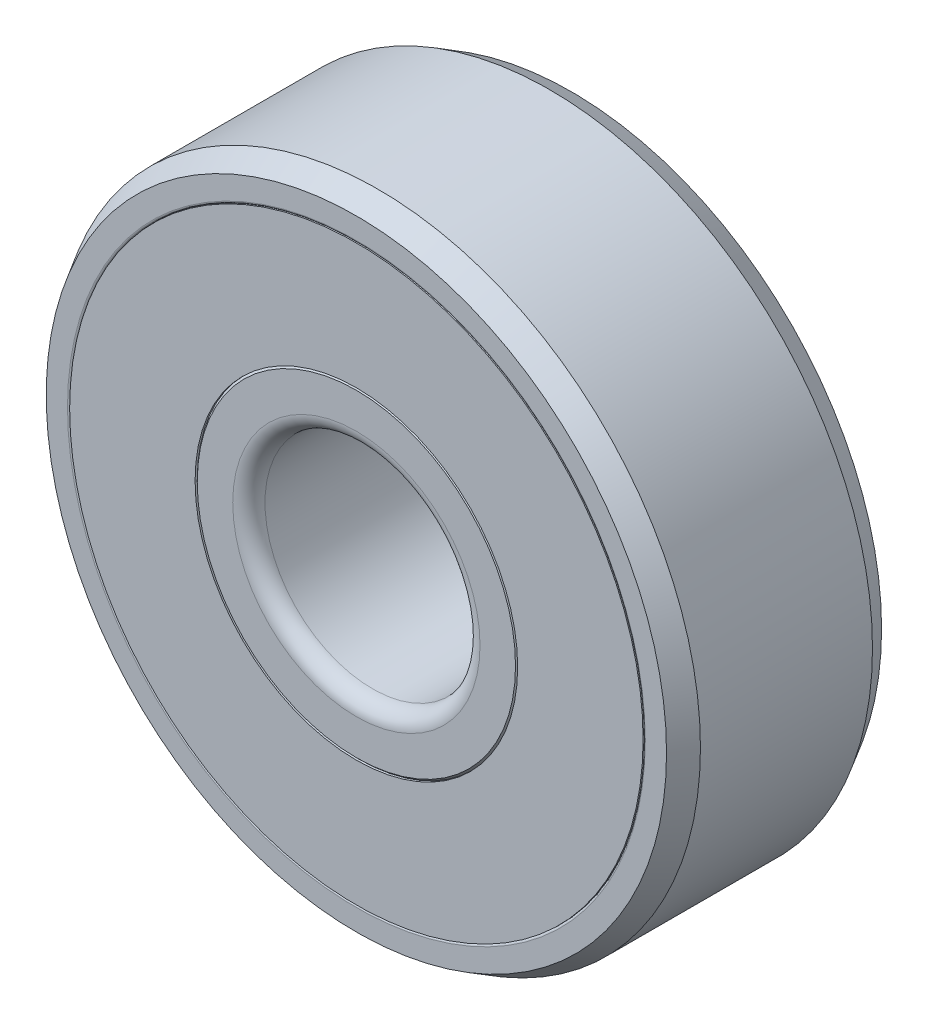
ISO-10303-21;
HEADER;
FILE_DESCRIPTION(('STEP AP214'),'2;1');
FILE_NAME('part.step','',(''),(''),'','','');
FILE_SCHEMA(('AUTOMOTIVE_DESIGN { 1 0 10303 214 1 1 1 1 }'));
ENDSEC;
DATA;
#1=APPLICATION_CONTEXT('core data for automotive mechanical design processes');
#2=APPLICATION_PROTOCOL_DEFINITION('international standard','automotive_design',2000,#1);
#3=PRODUCT_CONTEXT('',#1,'mechanical');
#4=PRODUCT('Part','Part','',(#3));
#5=PRODUCT_RELATED_PRODUCT_CATEGORY('part','',(#4));
#6=PRODUCT_DEFINITION_FORMATION('','',#4);
#7=PRODUCT_DEFINITION_CONTEXT('part definition',#1,'design');
#8=PRODUCT_DEFINITION('design','',#6,#7);
#9=PRODUCT_DEFINITION_SHAPE('','',#8);
#10=(LENGTH_UNIT() NAMED_UNIT(*) SI_UNIT(.MILLI.,.METRE.));
#11=(NAMED_UNIT(*) PLANE_ANGLE_UNIT() SI_UNIT($,.RADIAN.));
#12=(NAMED_UNIT(*) SI_UNIT($,.STERADIAN.) SOLID_ANGLE_UNIT());
#13=UNCERTAINTY_MEASURE_WITH_UNIT(LENGTH_MEASURE(1.E-05),#10,'distance_accuracy_value','');
#14=(GEOMETRIC_REPRESENTATION_CONTEXT(3) GLOBAL_UNCERTAINTY_ASSIGNED_CONTEXT((#13)) GLOBAL_UNIT_ASSIGNED_CONTEXT((#10,
#11,#12)) REPRESENTATION_CONTEXT('',''));
#15=CARTESIAN_POINT('',(0.,0.,0.));
#16=DIRECTION('',(0.,0.,1.));
#17=DIRECTION('',(1.,0.,0.));
#18=AXIS2_PLACEMENT_3D('',#15,#16,#17);
#19=CARTESIAN_POINT('',(3.25763117695009,-2.59787417441143,0.));
#20=DIRECTION('',(-0.781831482468022,0.623489801858743,0.));
#21=DIRECTION('',(0.,0.,-1.));
#22=AXIS2_PLACEMENT_3D('',#19,#20,#21);
#23=SPHERICAL_SURFACE('',#22,1.61111111111111);
#24=CARTESIAN_POINT('',(1.99801378852939,-1.59336282697234,0.));
#25=VERTEX_POINT('',#24);
#26=VERTEX_LOOP('',#25);
#27=FACE_BOUND('',#26,.T.);
#28=ADVANCED_FACE('F44',(#27),#23,.T.);
#29=CLOSED_SHELL('',(#28));
#30=MANIFOLD_SOLID_BREP('B2',#29);
#31=CARTESIAN_POINT('',(4.06219963409094,0.927170558151271,0.));
#32=DIRECTION('',(-0.974927912181826,-0.222520933956305,0.));
#33=DIRECTION('',(0.,0.,-1.));
#34=AXIS2_PLACEMENT_3D('',#31,#32,#33);
#35=SPHERICAL_SURFACE('',#34,1.61111111111111);
#36=CARTESIAN_POINT('',(2.49148244224244,0.568664608999446,0.));
#37=VERTEX_POINT('',#36);
#38=VERTEX_LOOP('',#37);
#39=FACE_BOUND('',#38,.T.);
#40=ADVANCED_FACE('F65',(#39),#35,.T.);
#41=CLOSED_SHELL('',(#40));
#42=MANIFOLD_SOLID_BREP('B6',#41);
#43=CARTESIAN_POINT('',(1.80784891298985,3.7540369495934,0.));
#44=DIRECTION('',(-0.433883739117565,-0.900968867902416,0.));
#45=DIRECTION('',(0.,0.,-1.));
#46=AXIS2_PLACEMENT_3D('',#43,#44,#45);
#47=SPHERICAL_SURFACE('',#46,1.61111111111111);
#48=CARTESIAN_POINT('',(1.10881399996711,2.30247599575062,0.));
#49=VERTEX_POINT('',#48);
#50=VERTEX_LOOP('',#49);
#51=FACE_BOUND('',#50,.T.);
#52=ADVANCED_FACE('F86',(#51),#47,.T.);
#53=CLOSED_SHELL('',(#52));
#54=MANIFOLD_SOLID_BREP('B40',#53);
#55=CARTESIAN_POINT('',(-1.8078489129898,3.75403694959342,0.));
#56=DIRECTION('',(0.433883739117553,-0.900968867902422,0.));
#57=DIRECTION('',(0.,0.,-1.));
#58=AXIS2_PLACEMENT_3D('',#55,#56,#57);
#59=SPHERICAL_SURFACE('',#58,1.61111111111111);
#60=CARTESIAN_POINT('',(-1.10881399996708,2.30247599575063,0.));
#61=VERTEX_POINT('',#60);
#62=VERTEX_LOOP('',#61);
#63=FACE_BOUND('',#62,.T.);
#64=ADVANCED_FACE('F107',(#63),#59,.T.);
#65=CLOSED_SHELL('',(#64));
#66=MANIFOLD_SOLID_BREP('B61',#65);
#67=CARTESIAN_POINT('',(-4.06219963409093,0.927170558151326,0.));
#68=DIRECTION('',(0.974927912181823,-0.222520933956318,0.));
#69=DIRECTION('',(0.,0.,-1.));
#70=AXIS2_PLACEMENT_3D('',#67,#68,#69);
#71=SPHERICAL_SURFACE('',#70,1.61111111111111);
#72=CARTESIAN_POINT('',(-2.49148244224244,0.56866460899948,0.));
#73=VERTEX_POINT('',#72);
#74=VERTEX_LOOP('',#73);
#75=FACE_BOUND('',#74,.T.);
#76=ADVANCED_FACE('F128',(#75),#71,.T.);
#77=CLOSED_SHELL('',(#76));
#78=MANIFOLD_SOLID_BREP('B82',#77);
#79=CARTESIAN_POINT('',(-3.25763117695013,-2.59787417441138,0.));
#80=DIRECTION('',(0.781831482468031,0.623489801858732,0.));
#81=DIRECTION('',(0.,0.,-1.));
#82=AXIS2_PLACEMENT_3D('',#79,#80,#81);
#83=SPHERICAL_SURFACE('',#82,1.61111111111111);
#84=CARTESIAN_POINT('',(-1.99801378852941,-1.59336282697231,0.));
#85=VERTEX_POINT('',#84);
#86=VERTEX_LOOP('',#85);
#87=FACE_BOUND('',#86,.T.);
#88=ADVANCED_FACE('F149',(#87),#83,.T.);
#89=CLOSED_SHELL('',(#88));
#90=MANIFOLD_SOLID_BREP('B103',#89);
#91=CARTESIAN_POINT('',(0.,-4.16666666666667,0.));
#92=DIRECTION('',(0.,1.,0.));
#93=DIRECTION('',(0.,0.,-1.));
#94=AXIS2_PLACEMENT_3D('',#91,#92,#93);
#95=SPHERICAL_SURFACE('',#94,1.61111111111111);
#96=CARTESIAN_POINT('',(0.,-2.55555555555555,0.));
#97=VERTEX_POINT('',#96);
#98=VERTEX_LOOP('',#97);
#99=FACE_BOUND('',#98,.T.);
#100=ADVANCED_FACE('F172',(#99),#95,.T.);
#101=CLOSED_SHELL('',(#100));
#102=MANIFOLD_SOLID_BREP('B124',#101);
#103=CARTESIAN_POINT('',(0.,-3.,2.));
#104=DIRECTION('',(0.,0.,1.));
#105=DIRECTION('',(1.,0.,0.));
#106=AXIS2_PLACEMENT_3D('',#103,#104,#105);
#107=PLANE('',#106);
#108=CARTESIAN_POINT('',(0.,0.,2.));
#109=DIRECTION('',(0.,0.,1.));
#110=DIRECTION('',(1.,0.,0.));
#111=AXIS2_PLACEMENT_3D('',#108,#109,#110);
#112=CIRCLE('',#111,5.33333333333333);
#113=CARTESIAN_POINT('',(5.33333333333333,0.,2.));
#114=VERTEX_POINT('',#113);
#115=EDGE_CURVE('E171',#114,#114,#112,.T.);
#116=ORIENTED_EDGE('',*,*,#115,.T.);
#117=EDGE_LOOP('',(#116));
#118=FACE_BOUND('',#117,.T.);
#119=CARTESIAN_POINT('',(0.,0.,2.));
#120=DIRECTION('',(0.,0.,1.));
#121=DIRECTION('',(1.,0.,0.));
#122=AXIS2_PLACEMENT_3D('',#119,#120,#121);
#123=CIRCLE('',#122,3.);
#124=CARTESIAN_POINT('',(3.,0.,2.));
#125=VERTEX_POINT('',#124);
#126=EDGE_CURVE('E209',#125,#125,#123,.T.);
#127=ORIENTED_EDGE('',*,*,#126,.F.);
#128=EDGE_LOOP('',(#127));
#129=FACE_BOUND('',#128,.T.);
#130=ADVANCED_FACE('F195',(#118,#129),#107,.T.);
#131=CARTESIAN_POINT('',(0.,0.,2.));
#132=DIRECTION('',(0.,0.,1.));
#133=DIRECTION('',(1.,0.,0.));
#134=AXIS2_PLACEMENT_3D('',#131,#132,#133);
#135=CYLINDRICAL_SURFACE('',#134,5.33333333333333);
#136=CARTESIAN_POINT('',(0.,0.,1.70833333333333));
#137=DIRECTION('',(0.,0.,1.));
#138=DIRECTION('',(1.,0.,0.));
#139=AXIS2_PLACEMENT_3D('',#136,#137,#138);
#140=CIRCLE('',#139,5.33333333333333);
#141=CARTESIAN_POINT('',(5.33333333333333,0.,1.70833333333333));
#142=VERTEX_POINT('',#141);
#143=EDGE_CURVE('E201',#142,#142,#140,.T.);
#144=ORIENTED_EDGE('',*,*,#143,.T.);
#145=EDGE_LOOP('',(#144));
#146=FACE_BOUND('',#145,.T.);
#147=ORIENTED_EDGE('',*,*,#115,.F.);
#148=EDGE_LOOP('',(#147));
#149=FACE_BOUND('',#148,.T.);
#150=ADVANCED_FACE('F219',(#146,#149),#135,.T.);
#151=CARTESIAN_POINT('',(0.,-3.,1.70833333333333));
#152=DIRECTION('',(0.,0.,-1.));
#153=DIRECTION('',(-1.,0.,0.));
#154=AXIS2_PLACEMENT_3D('',#151,#152,#153);
#155=PLANE('',#154);
#156=CARTESIAN_POINT('',(0.,0.,1.70833333333333));
#157=DIRECTION('',(0.,0.,1.));
#158=DIRECTION('',(1.,0.,0.));
#159=AXIS2_PLACEMENT_3D('',#156,#157,#158);
#160=CIRCLE('',#159,3.);
#161=CARTESIAN_POINT('',(3.,0.,1.70833333333333));
#162=VERTEX_POINT('',#161);
#163=EDGE_CURVE('E205',#162,#162,#160,.T.);
#164=ORIENTED_EDGE('',*,*,#163,.T.);
#165=EDGE_LOOP('',(#164));
#166=FACE_BOUND('',#165,.T.);
#167=ORIENTED_EDGE('',*,*,#143,.F.);
#168=EDGE_LOOP('',(#167));
#169=FACE_BOUND('',#168,.T.);
#170=ADVANCED_FACE('F223',(#166,#169),#155,.T.);
#171=CARTESIAN_POINT('',(0.,0.,2.));
#172=DIRECTION('',(0.,0.,1.));
#173=DIRECTION('',(1.,0.,0.));
#174=AXIS2_PLACEMENT_3D('',#171,#172,#173);
#175=CYLINDRICAL_SURFACE('',#174,3.);
#176=ORIENTED_EDGE('',*,*,#126,.T.);
#177=EDGE_LOOP('',(#176));
#178=FACE_BOUND('',#177,.T.);
#179=ORIENTED_EDGE('',*,*,#163,.F.);
#180=EDGE_LOOP('',(#179));
#181=FACE_BOUND('',#180,.T.);
#182=ADVANCED_FACE('F215',(#178,#181),#175,.F.);
#183=CLOSED_SHELL('',(#130,#150,#170,#182));
#184=MANIFOLD_SOLID_BREP('B145',#183);
#185=CARTESIAN_POINT('',(0.,0.,1.7));
#186=DIRECTION('',(0.,0.,1.));
#187=DIRECTION('',(1.,0.,0.));
#188=AXIS2_PLACEMENT_3D('',#185,#186,#187);
#189=TOROIDAL_SURFACE('',#188,2.3,0.3);
#190=CARTESIAN_POINT('',(0.,0.,2.));
#191=DIRECTION('',(0.,0.,1.));
#192=DIRECTION('',(1.,0.,0.));
#193=AXIS2_PLACEMENT_3D('',#190,#191,#192);
#194=CIRCLE('',#193,2.3);
#195=CARTESIAN_POINT('',(2.3,0.,2.));
#196=VERTEX_POINT('',#195);
#197=EDGE_CURVE('E194',#196,#196,#194,.T.);
#198=ORIENTED_EDGE('',*,*,#197,.T.);
#199=EDGE_LOOP('',(#198));
#200=FACE_BOUND('',#199,.T.);
#201=CARTESIAN_POINT('',(0.,0.,1.7));
#202=DIRECTION('',(0.,0.,1.));
#203=DIRECTION('',(1.,0.,0.));
#204=AXIS2_PLACEMENT_3D('',#201,#202,#203);
#205=CIRCLE('',#204,2.);
#206=CARTESIAN_POINT('',(2.,0.,1.7));
#207=VERTEX_POINT('',#206);
#208=EDGE_CURVE('E300',#207,#207,#205,.T.);
#209=ORIENTED_EDGE('',*,*,#208,.F.);
#210=EDGE_LOOP('',(#209));
#211=FACE_BOUND('',#210,.T.);
#212=ADVANCED_FACE('F266',(#200,#211),#189,.T.);
#213=CARTESIAN_POINT('',(0.,-2.96,2.));
#214=DIRECTION('',(0.,0.,1.));
#215=DIRECTION('',(1.,0.,0.));
#216=AXIS2_PLACEMENT_3D('',#213,#214,#215);
#217=PLANE('',#216);
#218=CARTESIAN_POINT('',(0.,0.,2.));
#219=DIRECTION('',(0.,0.,1.));
#220=DIRECTION('',(1.,0.,0.));
#221=AXIS2_PLACEMENT_3D('',#218,#219,#220);
#222=CIRCLE('',#221,2.96);
#223=CARTESIAN_POINT('',(2.96,0.,2.));
#224=VERTEX_POINT('',#223);
#225=EDGE_CURVE('E272',#224,#224,#222,.T.);
#226=ORIENTED_EDGE('',*,*,#225,.T.);
#227=EDGE_LOOP('',(#226));
#228=FACE_BOUND('',#227,.T.);
#229=ORIENTED_EDGE('',*,*,#197,.F.);
#230=EDGE_LOOP('',(#229));
#231=FACE_BOUND('',#230,.T.);
#232=ADVANCED_FACE('F308',(#228,#231),#217,.T.);
#233=CARTESIAN_POINT('',(0.,0.,2.));
#234=DIRECTION('',(0.,0.,-1.));
#235=DIRECTION('',(-1.,0.,0.));
#236=AXIS2_PLACEMENT_3D('',#233,#234,#235);
#237=CONICAL_SURFACE('',#236,2.96,0.785398163397448);
#238=CARTESIAN_POINT('',(0.,0.,1.96));
#239=DIRECTION('',(0.,0.,1.));
#240=DIRECTION('',(1.,0.,0.));
#241=AXIS2_PLACEMENT_3D('',#238,#239,#240);
#242=CIRCLE('',#241,3.);
#243=CARTESIAN_POINT('',(3.,0.,1.96));
#244=VERTEX_POINT('',#243);
#245=EDGE_CURVE('E276',#244,#244,#242,.T.);
#246=ORIENTED_EDGE('',*,*,#245,.T.);
#247=EDGE_LOOP('',(#246));
#248=FACE_BOUND('',#247,.T.);
#249=ORIENTED_EDGE('',*,*,#225,.F.);
#250=EDGE_LOOP('',(#249));
#251=FACE_BOUND('',#250,.T.);
#252=ADVANCED_FACE('F312',(#248,#251),#237,.T.);
#253=CARTESIAN_POINT('',(0.,0.,2.));
#254=DIRECTION('',(0.,0.,1.));
#255=DIRECTION('',(1.,0.,0.));
#256=AXIS2_PLACEMENT_3D('',#253,#254,#255);
#257=CYLINDRICAL_SURFACE('',#256,3.);
#258=CARTESIAN_POINT('',(0.,0.,1.11111111111111));
#259=DIRECTION('',(0.,0.,1.));
#260=DIRECTION('',(1.,0.,0.));
#261=AXIS2_PLACEMENT_3D('',#258,#259,#260);
#262=CIRCLE('',#261,3.);
#263=CARTESIAN_POINT('',(3.,0.,1.11111111111111));
#264=VERTEX_POINT('',#263);
#265=EDGE_CURVE('E280',#264,#264,#262,.T.);
#266=ORIENTED_EDGE('',*,*,#265,.T.);
#267=EDGE_LOOP('',(#266));
#268=FACE_BOUND('',#267,.T.);
#269=ORIENTED_EDGE('',*,*,#245,.F.);
#270=EDGE_LOOP('',(#269));
#271=FACE_BOUND('',#270,.T.);
#272=ADVANCED_FACE('F316',(#268,#271),#257,.T.);
#273=CARTESIAN_POINT('',(0.,0.,0.));
#274=DIRECTION('',(0.,0.,1.));
#275=DIRECTION('',(1.,0.,0.));
#276=AXIS2_PLACEMENT_3D('',#273,#274,#275);
#277=TOROIDAL_SURFACE('',#276,4.16666666666667,1.61111111111111);
#278=CARTESIAN_POINT('',(0.,0.,-1.11111111111111));
#279=DIRECTION('',(0.,0.,1.));
#280=DIRECTION('',(1.,0.,0.));
#281=AXIS2_PLACEMENT_3D('',#278,#279,#280);
#282=CIRCLE('',#281,3.);
#283=CARTESIAN_POINT('',(3.,0.,-1.11111111111111));
#284=VERTEX_POINT('',#283);
#285=EDGE_CURVE('E285',#284,#284,#282,.T.);
#286=ORIENTED_EDGE('',*,*,#285,.T.);
#287=EDGE_LOOP('',(#286));
#288=FACE_BOUND('',#287,.T.);
#289=ORIENTED_EDGE('',*,*,#265,.F.);
#290=EDGE_LOOP('',(#289));
#291=FACE_BOUND('',#290,.T.);
#292=ADVANCED_FACE('F323',(#288,#291),#277,.F.);
#293=CARTESIAN_POINT('',(0.,0.,2.));
#294=DIRECTION('',(0.,0.,1.));
#295=DIRECTION('',(1.,0.,0.));
#296=AXIS2_PLACEMENT_3D('',#293,#294,#295);
#297=CYLINDRICAL_SURFACE('',#296,3.);
#298=CARTESIAN_POINT('',(0.,0.,-1.96));
#299=DIRECTION('',(0.,0.,1.));
#300=DIRECTION('',(1.,0.,0.));
#301=AXIS2_PLACEMENT_3D('',#298,#299,#300);
#302=CIRCLE('',#301,3.);
#303=CARTESIAN_POINT('',(3.,0.,-1.96));
#304=VERTEX_POINT('',#303);
#305=EDGE_CURVE('E288',#304,#304,#302,.T.);
#306=ORIENTED_EDGE('',*,*,#305,.T.);
#307=EDGE_LOOP('',(#306));
#308=FACE_BOUND('',#307,.T.);
#309=ORIENTED_EDGE('',*,*,#285,.F.);
#310=EDGE_LOOP('',(#309));
#311=FACE_BOUND('',#310,.T.);
#312=ADVANCED_FACE('F327',(#308,#311),#297,.T.);
#313=CARTESIAN_POINT('',(0.,0.,-1.96));
#314=DIRECTION('',(0.,0.,1.));
#315=DIRECTION('',(1.,0.,0.));
#316=AXIS2_PLACEMENT_3D('',#313,#314,#315);
#317=CONICAL_SURFACE('',#316,3.,0.785398163397448);
#318=CARTESIAN_POINT('',(0.,0.,-2.));
#319=DIRECTION('',(0.,0.,1.));
#320=DIRECTION('',(1.,0.,0.));
#321=AXIS2_PLACEMENT_3D('',#318,#319,#320);
#322=CIRCLE('',#321,2.96);
#323=CARTESIAN_POINT('',(2.96,0.,-2.));
#324=VERTEX_POINT('',#323);
#325=EDGE_CURVE('E291',#324,#324,#322,.T.);
#326=ORIENTED_EDGE('',*,*,#325,.T.);
#327=EDGE_LOOP('',(#326));
#328=FACE_BOUND('',#327,.T.);
#329=ORIENTED_EDGE('',*,*,#305,.F.);
#330=EDGE_LOOP('',(#329));
#331=FACE_BOUND('',#330,.T.);
#332=ADVANCED_FACE('F331',(#328,#331),#317,.T.);
#333=CARTESIAN_POINT('',(0.,-2.96,-2.));
#334=DIRECTION('',(0.,0.,-1.));
#335=DIRECTION('',(-1.,0.,0.));
#336=AXIS2_PLACEMENT_3D('',#333,#334,#335);
#337=PLANE('',#336);
#338=CARTESIAN_POINT('',(0.,0.,-2.));
#339=DIRECTION('',(0.,0.,1.));
#340=DIRECTION('',(1.,0.,0.));
#341=AXIS2_PLACEMENT_3D('',#338,#339,#340);
#342=CIRCLE('',#341,2.3);
#343=CARTESIAN_POINT('',(2.3,0.,-2.));
#344=VERTEX_POINT('',#343);
#345=EDGE_CURVE('E294',#344,#344,#342,.T.);
#346=ORIENTED_EDGE('',*,*,#345,.T.);
#347=EDGE_LOOP('',(#346));
#348=FACE_BOUND('',#347,.T.);
#349=ORIENTED_EDGE('',*,*,#325,.F.);
#350=EDGE_LOOP('',(#349));
#351=FACE_BOUND('',#350,.T.);
#352=ADVANCED_FACE('F335',(#348,#351),#337,.T.);
#353=CARTESIAN_POINT('',(0.,0.,-1.7));
#354=DIRECTION('',(0.,0.,1.));
#355=DIRECTION('',(1.,0.,0.));
#356=AXIS2_PLACEMENT_3D('',#353,#354,#355);
#357=TOROIDAL_SURFACE('',#356,2.3,0.3);
#358=CARTESIAN_POINT('',(0.,0.,-1.7));
#359=DIRECTION('',(0.,0.,1.));
#360=DIRECTION('',(1.,0.,0.));
#361=AXIS2_PLACEMENT_3D('',#358,#359,#360);
#362=CIRCLE('',#361,2.);
#363=CARTESIAN_POINT('',(2.,0.,-1.7));
#364=VERTEX_POINT('',#363);
#365=EDGE_CURVE('E297',#364,#364,#362,.T.);
#366=ORIENTED_EDGE('',*,*,#365,.T.);
#367=EDGE_LOOP('',(#366));
#368=FACE_BOUND('',#367,.T.);
#369=ORIENTED_EDGE('',*,*,#345,.F.);
#370=EDGE_LOOP('',(#369));
#371=FACE_BOUND('',#370,.T.);
#372=ADVANCED_FACE('F339',(#368,#371),#357,.T.);
#373=CARTESIAN_POINT('',(0.,0.,2.));
#374=DIRECTION('',(0.,0.,1.));
#375=DIRECTION('',(1.,0.,0.));
#376=AXIS2_PLACEMENT_3D('',#373,#374,#375);
#377=CYLINDRICAL_SURFACE('',#376,2.);
#378=ORIENTED_EDGE('',*,*,#208,.T.);
#379=EDGE_LOOP('',(#378));
#380=FACE_BOUND('',#379,.T.);
#381=ORIENTED_EDGE('',*,*,#365,.F.);
#382=EDGE_LOOP('',(#381));
#383=FACE_BOUND('',#382,.T.);
#384=ADVANCED_FACE('F304',(#380,#383),#377,.F.);
#385=CLOSED_SHELL('',(#212,#232,#252,#272,#292,#312,#332,#352,#372,#384));
#386=MANIFOLD_SOLID_BREP('B166',#385);
#387=CARTESIAN_POINT('',(0.,0.,2.));
#388=DIRECTION('',(0.,0.,-1.));
#389=DIRECTION('',(-1.,0.,0.));
#390=AXIS2_PLACEMENT_3D('',#387,#388,#389);
#391=CONICAL_SURFACE('',#390,5.76905989232416,0.523598775598278);
#392=CARTESIAN_POINT('',(0.,0.,1.6));
#393=DIRECTION('',(0.,0.,1.));
#394=DIRECTION('',(1.,0.,0.));
#395=AXIS2_PLACEMENT_3D('',#392,#393,#394);
#396=CIRCLE('',#395,6.);
#397=CARTESIAN_POINT('',(6.,0.,1.6));
#398=VERTEX_POINT('',#397);
#399=EDGE_CURVE('E265',#398,#398,#396,.T.);
#400=ORIENTED_EDGE('',*,*,#399,.T.);
#401=EDGE_LOOP('',(#400));
#402=FACE_BOUND('',#401,.T.);
#403=CARTESIAN_POINT('',(0.,0.,2.));
#404=DIRECTION('',(0.,0.,1.));
#405=DIRECTION('',(1.,0.,0.));
#406=AXIS2_PLACEMENT_3D('',#403,#404,#405);
#407=CIRCLE('',#406,5.76905989232416);
#408=CARTESIAN_POINT('',(5.76905989232416,0.,2.));
#409=VERTEX_POINT('',#408);
#410=EDGE_CURVE('E454',#409,#409,#407,.T.);
#411=ORIENTED_EDGE('',*,*,#410,.F.);
#412=EDGE_LOOP('',(#411));
#413=FACE_BOUND('',#412,.T.);
#414=ADVANCED_FACE('F420',(#402,#413),#391,.T.);
#415=CARTESIAN_POINT('',(0.,0.,2.));
#416=DIRECTION('',(0.,0.,1.));
#417=DIRECTION('',(1.,0.,0.));
#418=AXIS2_PLACEMENT_3D('',#415,#416,#417);
#419=CYLINDRICAL_SURFACE('',#418,6.);
#420=CARTESIAN_POINT('',(0.,0.,-1.6));
#421=DIRECTION('',(0.,0.,1.));
#422=DIRECTION('',(1.,0.,0.));
#423=AXIS2_PLACEMENT_3D('',#420,#421,#422);
#424=CIRCLE('',#423,6.);
#425=CARTESIAN_POINT('',(6.,0.,-1.6));
#426=VERTEX_POINT('',#425);
#427=EDGE_CURVE('E426',#426,#426,#424,.T.);
#428=ORIENTED_EDGE('',*,*,#427,.T.);
#429=EDGE_LOOP('',(#428));
#430=FACE_BOUND('',#429,.T.);
#431=ORIENTED_EDGE('',*,*,#399,.F.);
#432=EDGE_LOOP('',(#431));
#433=FACE_BOUND('',#432,.T.);
#434=ADVANCED_FACE('F462',(#430,#433),#419,.T.);
#435=CARTESIAN_POINT('',(0.,0.,-1.6));
#436=DIRECTION('',(0.,0.,1.));
#437=DIRECTION('',(1.,0.,0.));
#438=AXIS2_PLACEMENT_3D('',#435,#436,#437);
#439=CONICAL_SURFACE('',#438,6.,0.523598775598278);
#440=CARTESIAN_POINT('',(0.,0.,-2.));
#441=DIRECTION('',(0.,0.,1.));
#442=DIRECTION('',(1.,0.,0.));
#443=AXIS2_PLACEMENT_3D('',#440,#441,#442);
#444=CIRCLE('',#443,5.76905989232416);
#445=CARTESIAN_POINT('',(5.76905989232416,0.,-2.));
#446=VERTEX_POINT('',#445);
#447=EDGE_CURVE('E430',#446,#446,#444,.T.);
#448=ORIENTED_EDGE('',*,*,#447,.T.);
#449=EDGE_LOOP('',(#448));
#450=FACE_BOUND('',#449,.T.);
#451=ORIENTED_EDGE('',*,*,#427,.F.);
#452=EDGE_LOOP('',(#451));
#453=FACE_BOUND('',#452,.T.);
#454=ADVANCED_FACE('F466',(#450,#453),#439,.T.);
#455=CARTESIAN_POINT('',(0.,-5.37333333333333,-2.));
#456=DIRECTION('',(0.,0.,-1.));
#457=DIRECTION('',(-1.,0.,0.));
#458=AXIS2_PLACEMENT_3D('',#455,#456,#457);
#459=PLANE('',#458);
#460=CARTESIAN_POINT('',(0.,0.,-2.));
#461=DIRECTION('',(0.,0.,1.));
#462=DIRECTION('',(1.,0.,0.));
#463=AXIS2_PLACEMENT_3D('',#460,#461,#462);
#464=CIRCLE('',#463,5.37333333333333);
#465=CARTESIAN_POINT('',(5.37333333333333,0.,-2.));
#466=VERTEX_POINT('',#465);
#467=EDGE_CURVE('E434',#466,#466,#464,.T.);
#468=ORIENTED_EDGE('',*,*,#467,.T.);
#469=EDGE_LOOP('',(#468));
#470=FACE_BOUND('',#469,.T.);
#471=ORIENTED_EDGE('',*,*,#447,.F.);
#472=EDGE_LOOP('',(#471));
#473=FACE_BOUND('',#472,.T.);
#474=ADVANCED_FACE('F470',(#470,#473),#459,.T.);
#475=CARTESIAN_POINT('',(0.,0.,-1.96));
#476=DIRECTION('',(0.,0.,1.));
#477=DIRECTION('',(1.,0.,0.));
#478=AXIS2_PLACEMENT_3D('',#475,#476,#477);
#479=TOROIDAL_SURFACE('',#478,5.37333333333333,0.0400000000000001);
#480=CARTESIAN_POINT('',(0.,0.,-1.96));
#481=DIRECTION('',(0.,0.,1.));
#482=DIRECTION('',(1.,0.,0.));
#483=AXIS2_PLACEMENT_3D('',#480,#481,#482);
#484=CIRCLE('',#483,5.33333333333333);
#485=CARTESIAN_POINT('',(5.33333333333333,0.,-1.96));
#486=VERTEX_POINT('',#485);
#487=EDGE_CURVE('E439',#486,#486,#484,.T.);
#488=ORIENTED_EDGE('',*,*,#487,.T.);
#489=EDGE_LOOP('',(#488));
#490=FACE_BOUND('',#489,.T.);
#491=ORIENTED_EDGE('',*,*,#467,.F.);
#492=EDGE_LOOP('',(#491));
#493=FACE_BOUND('',#492,.T.);
#494=ADVANCED_FACE('F477',(#490,#493),#479,.T.);
#495=CARTESIAN_POINT('',(0.,0.,2.));
#496=DIRECTION('',(0.,0.,1.));
#497=DIRECTION('',(1.,0.,0.));
#498=AXIS2_PLACEMENT_3D('',#495,#496,#497);
#499=CYLINDRICAL_SURFACE('',#498,5.33333333333333);
#500=CARTESIAN_POINT('',(0.,0.,-1.11111111111111));
#501=DIRECTION('',(0.,0.,1.));
#502=DIRECTION('',(1.,0.,0.));
#503=AXIS2_PLACEMENT_3D('',#500,#501,#502);
#504=CIRCLE('',#503,5.33333333333333);
#505=CARTESIAN_POINT('',(5.33333333333333,0.,-1.11111111111111));
#506=VERTEX_POINT('',#505);
#507=EDGE_CURVE('E442',#506,#506,#504,.T.);
#508=ORIENTED_EDGE('',*,*,#507,.T.);
#509=EDGE_LOOP('',(#508));
#510=FACE_BOUND('',#509,.T.);
#511=ORIENTED_EDGE('',*,*,#487,.F.);
#512=EDGE_LOOP('',(#511));
#513=FACE_BOUND('',#512,.T.);
#514=ADVANCED_FACE('F481',(#510,#513),#499,.F.);
#515=CARTESIAN_POINT('',(0.,0.,0.));
#516=DIRECTION('',(0.,0.,1.));
#517=DIRECTION('',(1.,0.,0.));
#518=AXIS2_PLACEMENT_3D('',#515,#516,#517);
#519=TOROIDAL_SURFACE('',#518,4.16666666666667,1.61111111111111);
#520=CARTESIAN_POINT('',(0.,0.,1.11111111111111));
#521=DIRECTION('',(0.,0.,1.));
#522=DIRECTION('',(1.,0.,0.));
#523=AXIS2_PLACEMENT_3D('',#520,#521,#522);
#524=CIRCLE('',#523,5.33333333333333);
#525=CARTESIAN_POINT('',(5.33333333333333,0.,1.11111111111111));
#526=VERTEX_POINT('',#525);
#527=EDGE_CURVE('E445',#526,#526,#524,.T.);
#528=ORIENTED_EDGE('',*,*,#527,.T.);
#529=EDGE_LOOP('',(#528));
#530=FACE_BOUND('',#529,.T.);
#531=ORIENTED_EDGE('',*,*,#507,.F.);
#532=EDGE_LOOP('',(#531));
#533=FACE_BOUND('',#532,.T.);
#534=ADVANCED_FACE('F485',(#530,#533),#519,.F.);
#535=CARTESIAN_POINT('',(0.,0.,2.));
#536=DIRECTION('',(0.,0.,1.));
#537=DIRECTION('',(1.,0.,0.));
#538=AXIS2_PLACEMENT_3D('',#535,#536,#537);
#539=CYLINDRICAL_SURFACE('',#538,5.33333333333333);
#540=CARTESIAN_POINT('',(0.,0.,1.96));
#541=DIRECTION('',(0.,0.,1.));
#542=DIRECTION('',(1.,0.,0.));
#543=AXIS2_PLACEMENT_3D('',#540,#541,#542);
#544=CIRCLE('',#543,5.33333333333333);
#545=CARTESIAN_POINT('',(5.33333333333333,0.,1.96));
#546=VERTEX_POINT('',#545);
#547=EDGE_CURVE('E448',#546,#546,#544,.T.);
#548=ORIENTED_EDGE('',*,*,#547,.T.);
#549=EDGE_LOOP('',(#548));
#550=FACE_BOUND('',#549,.T.);
#551=ORIENTED_EDGE('',*,*,#527,.F.);
#552=EDGE_LOOP('',(#551));
#553=FACE_BOUND('',#552,.T.);
#554=ADVANCED_FACE('F489',(#550,#553),#539,.F.);
#555=CARTESIAN_POINT('',(0.,0.,1.96));
#556=DIRECTION('',(0.,0.,1.));
#557=DIRECTION('',(1.,0.,0.));
#558=AXIS2_PLACEMENT_3D('',#555,#556,#557);
#559=TOROIDAL_SURFACE('',#558,5.37333333333333,0.0400000000000001);
#560=CARTESIAN_POINT('',(0.,0.,2.));
#561=DIRECTION('',(0.,0.,1.));
#562=DIRECTION('',(1.,0.,0.));
#563=AXIS2_PLACEMENT_3D('',#560,#561,#562);
#564=CIRCLE('',#563,5.37333333333333);
#565=CARTESIAN_POINT('',(5.37333333333333,0.,2.));
#566=VERTEX_POINT('',#565);
#567=EDGE_CURVE('E451',#566,#566,#564,.T.);
#568=ORIENTED_EDGE('',*,*,#567,.T.);
#569=EDGE_LOOP('',(#568));
#570=FACE_BOUND('',#569,.T.);
#571=ORIENTED_EDGE('',*,*,#547,.F.);
#572=EDGE_LOOP('',(#571));
#573=FACE_BOUND('',#572,.T.);
#574=ADVANCED_FACE('F493',(#570,#573),#559,.T.);
#575=CARTESIAN_POINT('',(0.,-5.37333333333333,2.));
#576=DIRECTION('',(0.,0.,1.));
#577=DIRECTION('',(1.,0.,0.));
#578=AXIS2_PLACEMENT_3D('',#575,#576,#577);
#579=PLANE('',#578);
#580=ORIENTED_EDGE('',*,*,#410,.T.);
#581=EDGE_LOOP('',(#580));
#582=FACE_BOUND('',#581,.T.);
#583=ORIENTED_EDGE('',*,*,#567,.F.);
#584=EDGE_LOOP('',(#583));
#585=FACE_BOUND('',#584,.T.);
#586=ADVANCED_FACE('F458',(#582,#585),#579,.T.);
#587=CLOSED_SHELL('',(#414,#434,#454,#474,#494,#514,#534,#554,#574,#586));
#588=MANIFOLD_SOLID_BREP('B189',#587);
#589=ADVANCED_BREP_SHAPE_REPRESENTATION('',(#18,#30,#42,#54,#66,#78,#90,#102,#184,#386,#588),#14);
#590=SHAPE_DEFINITION_REPRESENTATION(#9,#589);
ENDSEC;
END-ISO-10303-21;
